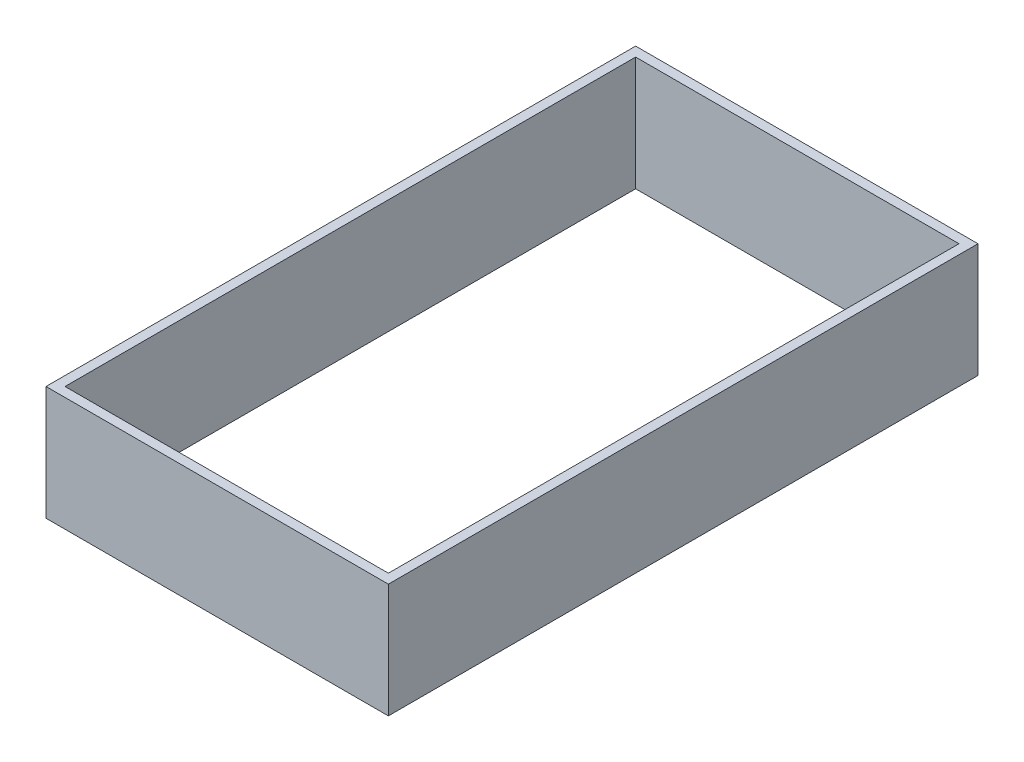
ISO-10303-21;
HEADER;
FILE_DESCRIPTION(('STEP AP214'),'2;1');
FILE_NAME('part.step','',(''),(''),'','','');
FILE_SCHEMA(('AUTOMOTIVE_DESIGN { 1 0 10303 214 1 1 1 1 }'));
ENDSEC;
DATA;
#1=APPLICATION_CONTEXT('core data for automotive mechanical design processes');
#2=APPLICATION_PROTOCOL_DEFINITION('international standard','automotive_design',2000,#1);
#3=PRODUCT_CONTEXT('',#1,'mechanical');
#4=PRODUCT('Part','Part','',(#3));
#5=PRODUCT_RELATED_PRODUCT_CATEGORY('part','',(#4));
#6=PRODUCT_DEFINITION_FORMATION('','',#4);
#7=PRODUCT_DEFINITION_CONTEXT('part definition',#1,'design');
#8=PRODUCT_DEFINITION('design','',#6,#7);
#9=PRODUCT_DEFINITION_SHAPE('','',#8);
#10=(LENGTH_UNIT() NAMED_UNIT(*) SI_UNIT(.MILLI.,.METRE.));
#11=(NAMED_UNIT(*) PLANE_ANGLE_UNIT() SI_UNIT($,.RADIAN.));
#12=(NAMED_UNIT(*) SI_UNIT($,.STERADIAN.) SOLID_ANGLE_UNIT());
#13=UNCERTAINTY_MEASURE_WITH_UNIT(LENGTH_MEASURE(1.E-05),#10,'distance_accuracy_value','');
#14=(GEOMETRIC_REPRESENTATION_CONTEXT(3) GLOBAL_UNCERTAINTY_ASSIGNED_CONTEXT((#13)) GLOBAL_UNIT_ASSIGNED_CONTEXT((#10,
#11,#12)) REPRESENTATION_CONTEXT('',''));
#15=CARTESIAN_POINT('',(0.,0.,0.));
#16=DIRECTION('',(0.,0.,1.));
#17=DIRECTION('',(1.,0.,0.));
#18=AXIS2_PLACEMENT_3D('',#15,#16,#17);
#19=CARTESIAN_POINT('',(-9000.,6000.,-15000.));
#20=DIRECTION('',(1.,0.,0.));
#21=DIRECTION('',(0.,0.,-1.));
#22=AXIS2_PLACEMENT_3D('',#19,#20,#21);
#23=PLANE('',#22);
#24=DIRECTION('',(0.,0.,1.));
#25=VECTOR('',#24,1.);
#26=CARTESIAN_POINT('',(-9000.,0.,-15000.));
#27=LINE('',#26,#25);
#28=CARTESIAN_POINT('',(-9000.,0.,-15500.));
#29=VERTEX_POINT('',#28);
#30=CARTESIAN_POINT('',(-9000.,0.,15500.));
#31=VERTEX_POINT('',#30);
#32=EDGE_CURVE('E178',#29,#31,#27,.T.);
#33=ORIENTED_EDGE('',*,*,#32,.T.);
#34=DIRECTION('',(0.,-1.,0.));
#35=VECTOR('',#34,1.);
#36=CARTESIAN_POINT('',(-9000.,6000.,15500.));
#37=LINE('',#36,#35);
#38=CARTESIAN_POINT('',(-9000.,6000.,15500.));
#39=VERTEX_POINT('',#38);
#40=EDGE_CURVE('E217',#39,#31,#37,.T.);
#41=ORIENTED_EDGE('',*,*,#40,.F.);
#42=DIRECTION('',(0.,0.,1.));
#43=VECTOR('',#42,1.);
#44=CARTESIAN_POINT('',(-9000.,6000.,-15000.));
#45=LINE('',#44,#43);
#46=CARTESIAN_POINT('',(-9000.,6000.,-15500.));
#47=VERTEX_POINT('',#46);
#48=EDGE_CURVE('E195',#47,#39,#45,.T.);
#49=ORIENTED_EDGE('',*,*,#48,.F.);
#50=DIRECTION('',(0.,-1.,0.));
#51=VECTOR('',#50,1.);
#52=CARTESIAN_POINT('',(-9000.,6000.,-15500.));
#53=LINE('',#52,#51);
#54=EDGE_CURVE('E194',#47,#29,#53,.T.);
#55=ORIENTED_EDGE('',*,*,#54,.T.);
#56=EDGE_LOOP('',(#33,#41,#49,#55));
#57=FACE_BOUND('',#56,.T.);
#58=ADVANCED_FACE('F111',(#57),#23,.F.);
#59=CARTESIAN_POINT('',(-8500.,6000.,-15000.));
#60=DIRECTION('',(1.,0.,0.));
#61=DIRECTION('',(0.,0.,-1.));
#62=AXIS2_PLACEMENT_3D('',#59,#60,#61);
#63=PLANE('',#62);
#64=DIRECTION('',(0.,0.,1.));
#65=VECTOR('',#64,1.);
#66=CARTESIAN_POINT('',(-8500.,0.,-15000.));
#67=LINE('',#66,#65);
#68=CARTESIAN_POINT('',(-8500.,0.,-15000.));
#69=VERTEX_POINT('',#68);
#70=CARTESIAN_POINT('',(-8500.,0.,15000.));
#71=VERTEX_POINT('',#70);
#72=EDGE_CURVE('E191',#69,#71,#67,.T.);
#73=ORIENTED_EDGE('',*,*,#72,.F.);
#74=DIRECTION('',(0.,-1.,0.));
#75=VECTOR('',#74,1.);
#76=CARTESIAN_POINT('',(-8500.,6000.,-15000.));
#77=LINE('',#76,#75);
#78=CARTESIAN_POINT('',(-8500.,6000.,-15000.));
#79=VERTEX_POINT('',#78);
#80=EDGE_CURVE('E122',#79,#69,#77,.T.);
#81=ORIENTED_EDGE('',*,*,#80,.F.);
#82=DIRECTION('',(0.,0.,1.));
#83=VECTOR('',#82,1.);
#84=CARTESIAN_POINT('',(-8500.,6000.,-15000.));
#85=LINE('',#84,#83);
#86=CARTESIAN_POINT('',(-8500.,6000.,15000.));
#87=VERTEX_POINT('',#86);
#88=EDGE_CURVE('E190',#79,#87,#85,.T.);
#89=ORIENTED_EDGE('',*,*,#88,.T.);
#90=DIRECTION('',(0.,-1.,0.));
#91=VECTOR('',#90,1.);
#92=CARTESIAN_POINT('',(-8500.,6000.,15000.));
#93=LINE('',#92,#91);
#94=EDGE_CURVE('E12',#87,#71,#93,.T.);
#95=ORIENTED_EDGE('',*,*,#94,.T.);
#96=EDGE_LOOP('',(#73,#81,#89,#95));
#97=FACE_BOUND('',#96,.T.);
#98=ADVANCED_FACE('F264',(#97),#63,.T.);
#99=CARTESIAN_POINT('',(0.,0.,0.));
#100=DIRECTION('',(0.,-1.,0.));
#101=DIRECTION('',(0.,0.,-1.));
#102=AXIS2_PLACEMENT_3D('',#99,#100,#101);
#103=PLANE('',#102);
#104=DIRECTION('',(1.,0.,0.));
#105=VECTOR('',#104,1.);
#106=CARTESIAN_POINT('',(-9000.,0.,-15500.));
#107=LINE('',#106,#105);
#108=CARTESIAN_POINT('',(9000.,0.,-15500.));
#109=VERTEX_POINT('',#108);
#110=EDGE_CURVE('E183',#29,#109,#107,.T.);
#111=ORIENTED_EDGE('',*,*,#110,.T.);
#112=DIRECTION('',(0.,0.,1.));
#113=VECTOR('',#112,1.);
#114=CARTESIAN_POINT('',(9000.,0.,15000.));
#115=LINE('',#114,#113);
#116=CARTESIAN_POINT('',(9000.,0.,15500.));
#117=VERTEX_POINT('',#116);
#118=EDGE_CURVE('E172',#109,#117,#115,.T.);
#119=ORIENTED_EDGE('',*,*,#118,.T.);
#120=DIRECTION('',(1.,0.,0.));
#121=VECTOR('',#120,1.);
#122=CARTESIAN_POINT('',(-9000.,0.,15500.));
#123=LINE('',#122,#121);
#124=EDGE_CURVE('E185',#31,#117,#123,.T.);
#125=ORIENTED_EDGE('',*,*,#124,.F.);
#126=ORIENTED_EDGE('',*,*,#32,.F.);
#127=EDGE_LOOP('',(#111,#119,#125,#126));
#128=FACE_BOUND('',#127,.T.);
#129=DIRECTION('',(0.,0.,1.));
#130=VECTOR('',#129,1.);
#131=CARTESIAN_POINT('',(8500.,0.,-15000.));
#132=LINE('',#131,#130);
#133=CARTESIAN_POINT('',(8500.,0.,-15000.));
#134=VERTEX_POINT('',#133);
#135=CARTESIAN_POINT('',(8500.,0.,15000.));
#136=VERTEX_POINT('',#135);
#137=EDGE_CURVE('E223',#134,#136,#132,.T.);
#138=ORIENTED_EDGE('',*,*,#137,.F.);
#139=DIRECTION('',(1.,0.,0.));
#140=VECTOR('',#139,1.);
#141=CARTESIAN_POINT('',(-9000.,0.,-15000.));
#142=LINE('',#141,#140);
#143=EDGE_CURVE('E204',#69,#134,#142,.T.);
#144=ORIENTED_EDGE('',*,*,#143,.F.);
#145=ORIENTED_EDGE('',*,*,#72,.T.);
#146=DIRECTION('',(1.,0.,0.));
#147=VECTOR('',#146,1.);
#148=CARTESIAN_POINT('',(-9000.,0.,15000.));
#149=LINE('',#148,#147);
#150=EDGE_CURVE('E236',#71,#136,#149,.T.);
#151=ORIENTED_EDGE('',*,*,#150,.T.);
#152=EDGE_LOOP('',(#138,#144,#145,#151));
#153=FACE_BOUND('',#152,.T.);
#154=ADVANCED_FACE('F180',(#128,#153),#103,.T.);
#155=CARTESIAN_POINT('',(0.,6000.,0.));
#156=DIRECTION('',(0.,-1.,0.));
#157=DIRECTION('',(0.,0.,-1.));
#158=AXIS2_PLACEMENT_3D('',#155,#156,#157);
#159=PLANE('',#158);
#160=DIRECTION('',(0.,0.,1.));
#161=VECTOR('',#160,1.);
#162=CARTESIAN_POINT('',(9000.,6000.,15000.));
#163=LINE('',#162,#161);
#164=CARTESIAN_POINT('',(9000.,6000.,-15500.));
#165=VERTEX_POINT('',#164);
#166=CARTESIAN_POINT('',(9000.,6000.,15500.));
#167=VERTEX_POINT('',#166);
#168=EDGE_CURVE('E246',#165,#167,#163,.T.);
#169=ORIENTED_EDGE('',*,*,#168,.F.);
#170=DIRECTION('',(1.,0.,0.));
#171=VECTOR('',#170,1.);
#172=CARTESIAN_POINT('',(-9000.,6000.,-15500.));
#173=LINE('',#172,#171);
#174=EDGE_CURVE('E200',#47,#165,#173,.T.);
#175=ORIENTED_EDGE('',*,*,#174,.F.);
#176=ORIENTED_EDGE('',*,*,#48,.T.);
#177=DIRECTION('',(1.,0.,0.));
#178=VECTOR('',#177,1.);
#179=CARTESIAN_POINT('',(-9000.,6000.,15500.));
#180=LINE('',#179,#178);
#181=EDGE_CURVE('E239',#39,#167,#180,.T.);
#182=ORIENTED_EDGE('',*,*,#181,.T.);
#183=EDGE_LOOP('',(#169,#175,#176,#182));
#184=FACE_BOUND('',#183,.T.);
#185=ORIENTED_EDGE('',*,*,#88,.F.);
#186=DIRECTION('',(1.,0.,0.));
#187=VECTOR('',#186,1.);
#188=CARTESIAN_POINT('',(-9000.,6000.,-15000.));
#189=LINE('',#188,#187);
#190=CARTESIAN_POINT('',(8500.,6000.,-15000.));
#191=VERTEX_POINT('',#190);
#192=EDGE_CURVE('E203',#79,#191,#189,.T.);
#193=ORIENTED_EDGE('',*,*,#192,.T.);
#194=DIRECTION('',(0.,0.,1.));
#195=VECTOR('',#194,1.);
#196=CARTESIAN_POINT('',(8500.,6000.,-15000.));
#197=LINE('',#196,#195);
#198=CARTESIAN_POINT('',(8500.,6000.,15000.));
#199=VERTEX_POINT('',#198);
#200=EDGE_CURVE('E222',#191,#199,#197,.T.);
#201=ORIENTED_EDGE('',*,*,#200,.T.);
#202=DIRECTION('',(1.,0.,0.));
#203=VECTOR('',#202,1.);
#204=CARTESIAN_POINT('',(-9000.,6000.,15000.));
#205=LINE('',#204,#203);
#206=EDGE_CURVE('E235',#87,#199,#205,.T.);
#207=ORIENTED_EDGE('',*,*,#206,.F.);
#208=EDGE_LOOP('',(#185,#193,#201,#207));
#209=FACE_BOUND('',#208,.T.);
#210=ADVANCED_FACE('F267',(#184,#209),#159,.F.);
#211=CARTESIAN_POINT('',(8500.,6000.,-15000.));
#212=DIRECTION('',(1.,0.,0.));
#213=DIRECTION('',(0.,0.,-1.));
#214=AXIS2_PLACEMENT_3D('',#211,#212,#213);
#215=PLANE('',#214);
#216=ORIENTED_EDGE('',*,*,#137,.T.);
#217=DIRECTION('',(0.,-1.,0.));
#218=VECTOR('',#217,1.);
#219=CARTESIAN_POINT('',(8500.,6000.,15000.));
#220=LINE('',#219,#218);
#221=EDGE_CURVE('E213',#199,#136,#220,.T.);
#222=ORIENTED_EDGE('',*,*,#221,.F.);
#223=ORIENTED_EDGE('',*,*,#200,.F.);
#224=DIRECTION('',(0.,-1.,0.));
#225=VECTOR('',#224,1.);
#226=CARTESIAN_POINT('',(8500.,6000.,-15000.));
#227=LINE('',#226,#225);
#228=EDGE_CURVE('E218',#191,#134,#227,.T.);
#229=ORIENTED_EDGE('',*,*,#228,.T.);
#230=EDGE_LOOP('',(#216,#222,#223,#229));
#231=FACE_BOUND('',#230,.T.);
#232=ADVANCED_FACE('F273',(#231),#215,.F.);
#233=CARTESIAN_POINT('',(-9000.,6000.,15500.));
#234=DIRECTION('',(0.,0.,-1.));
#235=DIRECTION('',(-1.,0.,0.));
#236=AXIS2_PLACEMENT_3D('',#233,#234,#235);
#237=PLANE('',#236);
#238=ORIENTED_EDGE('',*,*,#124,.T.);
#239=DIRECTION('',(0.,-1.,0.));
#240=VECTOR('',#239,1.);
#241=CARTESIAN_POINT('',(9000.,6000.,15500.));
#242=LINE('',#241,#240);
#243=EDGE_CURVE('E232',#167,#117,#242,.T.);
#244=ORIENTED_EDGE('',*,*,#243,.F.);
#245=ORIENTED_EDGE('',*,*,#181,.F.);
#246=ORIENTED_EDGE('',*,*,#40,.T.);
#247=EDGE_LOOP('',(#238,#244,#245,#246));
#248=FACE_BOUND('',#247,.T.);
#249=ADVANCED_FACE('F283',(#248),#237,.F.);
#250=CARTESIAN_POINT('',(9000.,6000.,15000.));
#251=DIRECTION('',(1.,0.,0.));
#252=DIRECTION('',(0.,0.,-1.));
#253=AXIS2_PLACEMENT_3D('',#250,#251,#252);
#254=PLANE('',#253);
#255=ORIENTED_EDGE('',*,*,#118,.F.);
#256=DIRECTION('',(0.,-1.,0.));
#257=VECTOR('',#256,1.);
#258=CARTESIAN_POINT('',(9000.,6000.,-15500.));
#259=LINE('',#258,#257);
#260=EDGE_CURVE('E115',#165,#109,#259,.T.);
#261=ORIENTED_EDGE('',*,*,#260,.F.);
#262=ORIENTED_EDGE('',*,*,#168,.T.);
#263=ORIENTED_EDGE('',*,*,#243,.T.);
#264=EDGE_LOOP('',(#255,#261,#262,#263));
#265=FACE_BOUND('',#264,.T.);
#266=ADVANCED_FACE('F278',(#265),#254,.T.);
#267=CARTESIAN_POINT('',(-9000.,6000.,-15000.));
#268=DIRECTION('',(0.,0.,-1.));
#269=DIRECTION('',(-1.,0.,0.));
#270=AXIS2_PLACEMENT_3D('',#267,#268,#269);
#271=PLANE('',#270);
#272=ORIENTED_EDGE('',*,*,#80,.T.);
#273=ORIENTED_EDGE('',*,*,#143,.T.);
#274=ORIENTED_EDGE('',*,*,#228,.F.);
#275=ORIENTED_EDGE('',*,*,#192,.F.);
#276=EDGE_LOOP('',(#272,#273,#274,#275));
#277=FACE_BOUND('',#276,.T.);
#278=ADVANCED_FACE('F113',(#277),#271,.F.);
#279=CARTESIAN_POINT('',(-9000.,6000.,-15500.));
#280=DIRECTION('',(0.,0.,-1.));
#281=DIRECTION('',(-1.,0.,0.));
#282=AXIS2_PLACEMENT_3D('',#279,#280,#281);
#283=PLANE('',#282);
#284=ORIENTED_EDGE('',*,*,#110,.F.);
#285=ORIENTED_EDGE('',*,*,#54,.F.);
#286=ORIENTED_EDGE('',*,*,#174,.T.);
#287=ORIENTED_EDGE('',*,*,#260,.T.);
#288=EDGE_LOOP('',(#284,#285,#286,#287));
#289=FACE_BOUND('',#288,.T.);
#290=ADVANCED_FACE('F201',(#289),#283,.T.);
#291=CARTESIAN_POINT('',(-9000.,6000.,15000.));
#292=DIRECTION('',(0.,0.,-1.));
#293=DIRECTION('',(-1.,0.,0.));
#294=AXIS2_PLACEMENT_3D('',#291,#292,#293);
#295=PLANE('',#294);
#296=ORIENTED_EDGE('',*,*,#150,.F.);
#297=ORIENTED_EDGE('',*,*,#94,.F.);
#298=ORIENTED_EDGE('',*,*,#206,.T.);
#299=ORIENTED_EDGE('',*,*,#221,.T.);
#300=EDGE_LOOP('',(#296,#297,#298,#299));
#301=FACE_BOUND('',#300,.T.);
#302=ADVANCED_FACE('F271',(#301),#295,.T.);
#303=CLOSED_SHELL('',(#58,#98,#154,#210,#232,#249,#266,#278,#290,#302));
#304=MANIFOLD_SOLID_BREP('B2',#303);
#305=ADVANCED_BREP_SHAPE_REPRESENTATION('',(#18,#304),#14);
#306=SHAPE_DEFINITION_REPRESENTATION(#9,#305);
ENDSEC;
END-ISO-10303-21;
